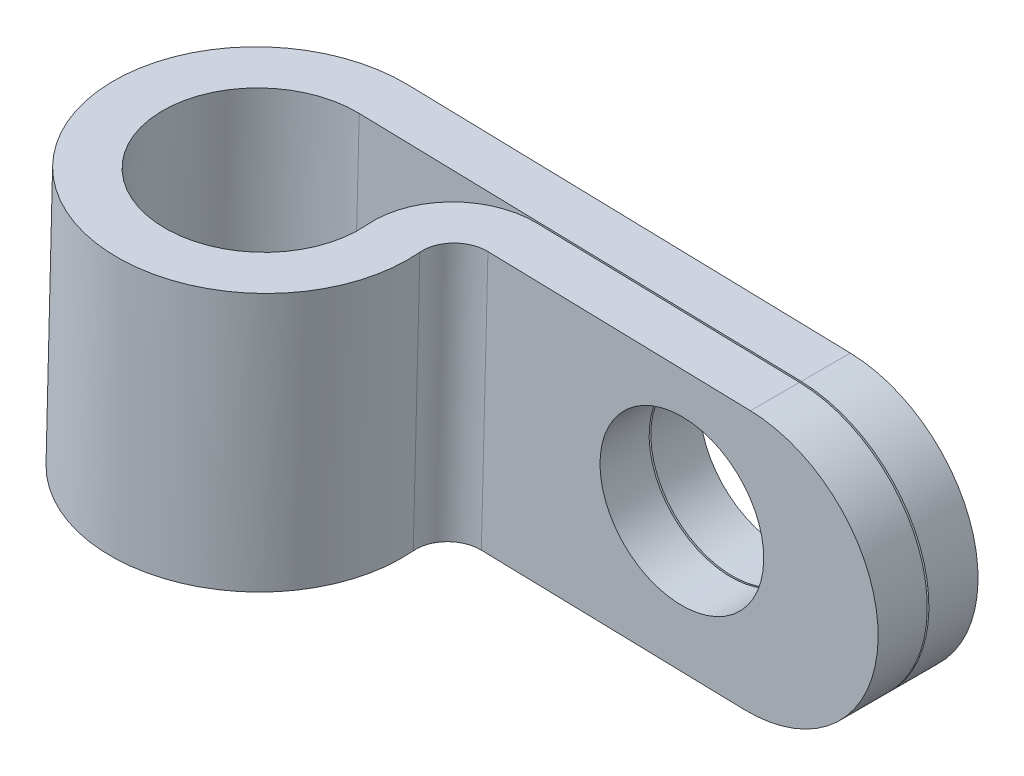
ISO-10303-21;
HEADER;
FILE_DESCRIPTION(('STEP AP214'),'2;1');
FILE_NAME('part.step','',(''),(''),'','','');
FILE_SCHEMA(('AUTOMOTIVE_DESIGN { 1 0 10303 214 1 1 1 1 }'));
ENDSEC;
DATA;
#1=APPLICATION_CONTEXT('core data for automotive mechanical design processes');
#2=APPLICATION_PROTOCOL_DEFINITION('international standard','automotive_design',2000,#1);
#3=PRODUCT_CONTEXT('',#1,'mechanical');
#4=PRODUCT('Part','Part','',(#3));
#5=PRODUCT_RELATED_PRODUCT_CATEGORY('part','',(#4));
#6=PRODUCT_DEFINITION_FORMATION('','',#4);
#7=PRODUCT_DEFINITION_CONTEXT('part definition',#1,'design');
#8=PRODUCT_DEFINITION('design','',#6,#7);
#9=PRODUCT_DEFINITION_SHAPE('','',#8);
#10=(LENGTH_UNIT() NAMED_UNIT(*) SI_UNIT(.MILLI.,.METRE.));
#11=(NAMED_UNIT(*) PLANE_ANGLE_UNIT() SI_UNIT($,.RADIAN.));
#12=(NAMED_UNIT(*) SI_UNIT($,.STERADIAN.) SOLID_ANGLE_UNIT());
#13=UNCERTAINTY_MEASURE_WITH_UNIT(LENGTH_MEASURE(1.E-05),#10,'distance_accuracy_value','');
#14=(GEOMETRIC_REPRESENTATION_CONTEXT(3) GLOBAL_UNCERTAINTY_ASSIGNED_CONTEXT((#13)) GLOBAL_UNIT_ASSIGNED_CONTEXT((#10,
#11,#12)) REPRESENTATION_CONTEXT('',''));
#15=CARTESIAN_POINT('',(0.,0.,0.));
#16=DIRECTION('',(0.,0.,1.));
#17=DIRECTION('',(1.,0.,0.));
#18=AXIS2_PLACEMENT_3D('',#15,#16,#17);
#19=CARTESIAN_POINT('',(-21.5504359375814,20.7594482708352,-3.73272260314341));
#20=DIRECTION('',(0.,0.,1.));
#21=DIRECTION('',(0.,-1.,0.));
#22=AXIS2_PLACEMENT_3D('',#19,#20,#21);
#23=PLANE('',#22);
#24=DIRECTION('',(0.025131250496468,0.999684160246867,0.));
#25=VECTOR('',#24,1.);
#26=CARTESIAN_POINT('',(-27.6538751413675,20.9128837913924,-3.73272260314341));
#27=LINE('',#26,#25);
#28=CARTESIAN_POINT('',(-27.5517417393499,24.9756002186357,-3.73272260314341));
#29=VERTEX_POINT('',#28);
#30=CARTESIAN_POINT('',(-27.6538751413675,20.9128837913924,-3.73272260314341));
#31=VERTEX_POINT('',#30);
#32=EDGE_CURVE('E107',#29,#31,#27,.F.);
#33=ORIENTED_EDGE('',*,*,#32,.T.);
#34=DIRECTION('',(0.999684160246867,-0.0251312504964654,0.));
#35=VECTOR('',#34,1.);
#36=CARTESIAN_POINT('',(-27.6538751413675,20.9128837913924,-3.73272260314341));
#37=LINE('',#36,#35);
#38=CARTESIAN_POINT('',(-23.581794151203,20.810514971844,-3.73272260314341));
#39=VERTEX_POINT('',#38);
#40=EDGE_CURVE('E105',#39,#31,#37,.F.);
#41=ORIENTED_EDGE('',*,*,#40,.F.);
#42=CARTESIAN_POINT('',(-23.5307274501941,22.8418731854656,-3.73272260314341));
#43=DIRECTION('',(0.,0.,-1.));
#44=DIRECTION('',(0.,1.,0.));
#45=AXIS2_PLACEMENT_3D('',#42,#43,#44);
#46=CIRCLE('',#45,2.032);
#47=CARTESIAN_POINT('',(-23.4796607491853,24.8732313990872,-3.73272260314341));
#48=VERTEX_POINT('',#47);
#49=EDGE_CURVE('E95',#48,#39,#46,.T.);
#50=ORIENTED_EDGE('',*,*,#49,.F.);
#51=DIRECTION('',(-0.999684160246867,0.0251312504964654,0.));
#52=VECTOR('',#51,1.);
#53=CARTESIAN_POINT('',(-28.0578786449514,24.9883240907004,-3.73272260314341));
#54=LINE('',#53,#52);
#55=EDGE_CURVE('E89',#29,#48,#54,.F.);
#56=ORIENTED_EDGE('',*,*,#55,.F.);
#57=EDGE_LOOP('',(#33,#41,#50,#56));
#58=FACE_BOUND('',#57,.T.);
#59=CARTESIAN_POINT('',(-24.543214888192,22.9943664243214,-3.73272260314341));
#60=DIRECTION('',(0.,0.,-1.));
#61=DIRECTION('',(0.,1.,0.));
#62=AXIS2_PLACEMENT_3D('',#59,#60,#61);
#63=CIRCLE('',#62,1.27);
#64=CARTESIAN_POINT('',(-24.543214888192,24.2643664243214,-3.73272260314341));
#65=VERTEX_POINT('',#64);
#66=EDGE_CURVE('E20',#65,#65,#63,.T.);
#67=ORIENTED_EDGE('',*,*,#66,.T.);
#68=EDGE_LOOP('',(#67));
#69=FACE_BOUND('',#68,.T.);
#70=ADVANCED_FACE('F17',(#58,#69),#23,.T.);
#71=CARTESIAN_POINT('',(-24.543214888192,22.9943664243214,-0.71012260314341));
#72=DIRECTION('',(0.,0.,-1.));
#73=DIRECTION('',(0.,1.,0.));
#74=AXIS2_PLACEMENT_3D('',#71,#72,#73);
#75=CYLINDRICAL_SURFACE('',#74,1.27);
#76=CARTESIAN_POINT('',(-24.543214888192,22.9943664243214,-4.49472260314341));
#77=DIRECTION('',(0.,0.,-1.));
#78=DIRECTION('',(0.,1.,0.));
#79=AXIS2_PLACEMENT_3D('',#76,#77,#78);
#80=CIRCLE('',#79,1.27);
#81=CARTESIAN_POINT('',(-24.543214888192,24.2643664243214,-4.49472260314341));
#82=VERTEX_POINT('',#81);
#83=EDGE_CURVE('E155',#82,#82,#80,.T.);
#84=ORIENTED_EDGE('',*,*,#83,.T.);
#85=EDGE_LOOP('',(#84));
#86=FACE_BOUND('',#85,.T.);
#87=ORIENTED_EDGE('',*,*,#66,.F.);
#88=EDGE_LOOP('',(#87));
#89=FACE_BOUND('',#88,.T.);
#90=ADVANCED_FACE('F208',(#86,#89),#75,.F.);
#91=CARTESIAN_POINT('',(-23.5307274501941,22.8418731854656,-3.18315896677978));
#92=DIRECTION('',(0.,0.,-1.));
#93=DIRECTION('',(0.,1.,0.));
#94=AXIS2_PLACEMENT_3D('',#91,#92,#93);
#95=CYLINDRICAL_SURFACE('',#94,2.032);
#96=CARTESIAN_POINT('',(-23.5307274501941,22.8418731854656,-4.49472260314341));
#97=DIRECTION('',(0.,0.,-1.));
#98=DIRECTION('',(0.,1.,0.));
#99=AXIS2_PLACEMENT_3D('',#96,#97,#98);
#100=CIRCLE('',#99,2.032);
#101=CARTESIAN_POINT('',(-23.581794151203,20.810514971844,-4.49472260314341));
#102=VERTEX_POINT('',#101);
#103=CARTESIAN_POINT('',(-23.4796607491853,24.8732313990872,-4.49472260314341));
#104=VERTEX_POINT('',#103);
#105=EDGE_CURVE('E153',#102,#104,#100,.F.);
#106=ORIENTED_EDGE('',*,*,#105,.T.);
#107=DIRECTION('',(0.,0.,1.));
#108=VECTOR('',#107,1.);
#109=CARTESIAN_POINT('',(-23.4796607491853,24.8732313990872,-3.18315896677978));
#110=LINE('',#109,#108);
#111=EDGE_CURVE('E102',#48,#104,#110,.F.);
#112=ORIENTED_EDGE('',*,*,#111,.F.);
#113=ORIENTED_EDGE('',*,*,#49,.T.);
#114=DIRECTION('',(0.,0.,-1.));
#115=VECTOR('',#114,1.);
#116=CARTESIAN_POINT('',(-23.581794151203,20.810514971844,-3.73272260314341));
#117=LINE('',#116,#115);
#118=EDGE_CURVE('E100',#39,#102,#117,.T.);
#119=ORIENTED_EDGE('',*,*,#118,.T.);
#120=EDGE_LOOP('',(#106,#112,#113,#119));
#121=FACE_BOUND('',#120,.T.);
#122=ADVANCED_FACE('F98',(#121),#95,.T.);
#123=CARTESIAN_POINT('',(-27.6538751413675,20.9128837913924,-3.22472260314341));
#124=DIRECTION('',(0.025131250496468,0.999684160246867,0.));
#125=DIRECTION('',(-0.999684160246867,0.025131250496468,0.));
#126=AXIS2_PLACEMENT_3D('',#123,#124,#125);
#127=CYLINDRICAL_SURFACE('',#126,0.508);
#128=DIRECTION('',(0.0251312504964649,0.999684160246867,0.));
#129=VECTOR('',#128,1.);
#130=CARTESIAN_POINT('',(-28.160012046969,20.9256076634571,-3.18315896677978));
#131=LINE('',#130,#129);
#132=CARTESIAN_POINT('',(-28.160012046969,20.9256076634572,-3.18315896677978));
#133=VERTEX_POINT('',#132);
#134=CARTESIAN_POINT('',(-28.0578786449514,24.9883240907004,-3.18315896677977));
#135=VERTEX_POINT('',#134);
#136=EDGE_CURVE('E149',#133,#135,#131,.T.);
#137=ORIENTED_EDGE('',*,*,#136,.F.);
#138=CARTESIAN_POINT('',(-27.6538751413675,20.9128837913924,-3.22472260314341));
#139=DIRECTION('',(0.025131250496468,0.999684160246867,0.));
#140=DIRECTION('',(-0.999684160246867,0.025131250496468,0.));
#141=AXIS2_PLACEMENT_3D('',#138,#139,#140);
#142=CIRCLE('',#141,0.508);
#143=EDGE_CURVE('E150',#31,#133,#142,.T.);
#144=ORIENTED_EDGE('',*,*,#143,.F.);
#145=ORIENTED_EDGE('',*,*,#32,.F.);
#146=CARTESIAN_POINT('',(-27.5517417393499,24.9756002186357,-3.22472260314341));
#147=DIRECTION('',(0.025131250496468,0.999684160246867,0.));
#148=DIRECTION('',(-0.999684160246867,0.025131250496468,0.));
#149=AXIS2_PLACEMENT_3D('',#146,#147,#148);
#150=CIRCLE('',#149,0.508);
#151=EDGE_CURVE('E158',#135,#29,#150,.F.);
#152=ORIENTED_EDGE('',*,*,#151,.F.);
#153=EDGE_LOOP('',(#137,#144,#145,#152));
#154=FACE_BOUND('',#153,.T.);
#155=ADVANCED_FACE('F204',(#154),#127,.F.);
#156=CARTESIAN_POINT('',(-21.5504359375814,20.7594482708352,-4.49472260314341));
#157=DIRECTION('',(0.,0.,1.));
#158=DIRECTION('',(0.,-1.,0.));
#159=AXIS2_PLACEMENT_3D('',#156,#157,#158);
#160=PLANE('',#159);
#161=ORIENTED_EDGE('',*,*,#105,.F.);
#162=DIRECTION('',(0.999684160246867,-0.0251312504964748,0.));
#163=VECTOR('',#162,1.);
#164=CARTESIAN_POINT('',(-27.6538751413675,20.9128837913924,-4.49472260314341));
#165=LINE('',#164,#163);
#166=CARTESIAN_POINT('',(-27.6538751413675,20.9128837913924,-4.49472260314341));
#167=VERTEX_POINT('',#166);
#168=EDGE_CURVE('E115',#167,#102,#165,.T.);
#169=ORIENTED_EDGE('',*,*,#168,.F.);
#170=DIRECTION('',(0.0251312504964653,0.999684160246867,0.));
#171=VECTOR('',#170,1.);
#172=CARTESIAN_POINT('',(-27.6538751413675,20.9128837913924,-4.49472260314341));
#173=LINE('',#172,#171);
#174=CARTESIAN_POINT('',(-27.5517417393499,24.9756002186356,-4.49472260314341));
#175=VERTEX_POINT('',#174);
#176=EDGE_CURVE('E146',#175,#167,#173,.F.);
#177=ORIENTED_EDGE('',*,*,#176,.F.);
#178=DIRECTION('',(-0.999684160246867,0.025131250496462,0.));
#179=VECTOR('',#178,1.);
#180=CARTESIAN_POINT('',(-23.4796607491853,24.8732313990872,-4.49472260314341));
#181=LINE('',#180,#179);
#182=EDGE_CURVE('E152',#104,#175,#181,.T.);
#183=ORIENTED_EDGE('',*,*,#182,.F.);
#184=EDGE_LOOP('',(#161,#169,#177,#183));
#185=FACE_BOUND('',#184,.T.);
#186=ORIENTED_EDGE('',*,*,#83,.F.);
#187=EDGE_LOOP('',(#186));
#188=FACE_BOUND('',#187,.T.);
#189=ADVANCED_FACE('F201',(#185,#188),#160,.F.);
#190=CARTESIAN_POINT('',(-27.6538751413675,20.9128837913924,-3.22472260314341));
#191=DIRECTION('',(0.0251312504964653,0.999684160246867,0.));
#192=DIRECTION('',(-0.999684160246867,0.0251312504964653,0.));
#193=AXIS2_PLACEMENT_3D('',#190,#191,#192);
#194=CYLINDRICAL_SURFACE('',#193,1.27);
#195=CARTESIAN_POINT('',(-27.6538751413675,20.9128837913924,-3.22472260314341));
#196=DIRECTION('',(0.0251312504964653,0.999684160246867,0.));
#197=DIRECTION('',(-0.999684160246867,0.0251312504964653,0.));
#198=AXIS2_PLACEMENT_3D('',#195,#196,#197);
#199=CIRCLE('',#198,1.27);
#200=CARTESIAN_POINT('',(-28.9192174053714,20.9446934715544,-3.12081351223432));
#201=VERTEX_POINT('',#200);
#202=EDGE_CURVE('E143',#167,#201,#199,.T.);
#203=ORIENTED_EDGE('',*,*,#202,.T.);
#204=DIRECTION('',(0.0251312504964656,0.999684160246867,0.));
#205=VECTOR('',#204,1.);
#206=CARTESIAN_POINT('',(-28.9192174053714,20.9446934715543,-3.12081351223432));
#207=LINE('',#206,#205);
#208=CARTESIAN_POINT('',(-28.8170840033537,25.0074098987976,-3.12081351223432));
#209=VERTEX_POINT('',#208);
#210=EDGE_CURVE('E142',#201,#209,#207,.T.);
#211=ORIENTED_EDGE('',*,*,#210,.T.);
#212=CARTESIAN_POINT('',(-27.5517417393499,24.9756002186356,-3.22472260314341));
#213=DIRECTION('',(0.0251312504964653,0.999684160246867,0.));
#214=DIRECTION('',(-0.999684160246867,0.0251312504964653,0.));
#215=AXIS2_PLACEMENT_3D('',#212,#213,#214);
#216=CIRCLE('',#215,1.27);
#217=EDGE_CURVE('E147',#209,#175,#216,.F.);
#218=ORIENTED_EDGE('',*,*,#217,.T.);
#219=ORIENTED_EDGE('',*,*,#176,.T.);
#220=EDGE_LOOP('',(#203,#211,#218,#219));
#221=FACE_BOUND('',#220,.T.);
#222=ADVANCED_FACE('F197',(#221),#194,.T.);
#223=CARTESIAN_POINT('',(-30.437628122176,20.9828650877487,-2.99612260314342));
#224=DIRECTION('',(0.0251312504964649,0.999684160246867,0.));
#225=DIRECTION('',(-0.999684160246867,0.0251312504964649,0.));
#226=AXIS2_PLACEMENT_3D('',#223,#224,#225);
#227=CYLINDRICAL_SURFACE('',#226,2.286);
#228=CARTESIAN_POINT('',(-30.3354947201584,25.045581514992,-2.99612260314341));
#229=DIRECTION('',(0.0251312504964649,0.999684160246867,0.));
#230=DIRECTION('',(-0.999684160246867,0.0251312504964649,0.));
#231=AXIS2_PLACEMENT_3D('',#228,#229,#230);
#232=CIRCLE('',#231,2.286);
#233=CARTESIAN_POINT('',(-30.3354947201584,25.045581514992,-5.28212260314341));
#234=VERTEX_POINT('',#233);
#235=EDGE_CURVE('E140',#234,#135,#232,.T.);
#236=ORIENTED_EDGE('',*,*,#235,.F.);
#237=DIRECTION('',(0.0251312504964697,0.999684160246867,0.));
#238=VECTOR('',#237,1.);
#239=CARTESIAN_POINT('',(-30.437628122176,20.9828650877487,-5.28212260314341));
#240=LINE('',#239,#238);
#241=CARTESIAN_POINT('',(-30.437628122176,20.9828650877487,-5.28212260314341));
#242=VERTEX_POINT('',#241);
#243=EDGE_CURVE('E137',#242,#234,#240,.T.);
#244=ORIENTED_EDGE('',*,*,#243,.F.);
#245=CARTESIAN_POINT('',(-30.437628122176,20.9828650877487,-2.99612260314342));
#246=DIRECTION('',(0.0251312504964649,0.999684160246867,0.));
#247=DIRECTION('',(-0.999684160246867,0.0251312504964649,0.));
#248=AXIS2_PLACEMENT_3D('',#245,#246,#247);
#249=CIRCLE('',#248,2.286);
#250=EDGE_CURVE('E138',#133,#242,#249,.F.);
#251=ORIENTED_EDGE('',*,*,#250,.F.);
#252=ORIENTED_EDGE('',*,*,#136,.T.);
#253=EDGE_LOOP('',(#236,#244,#251,#252));
#254=FACE_BOUND('',#253,.T.);
#255=ADVANCED_FACE('F238',(#254),#227,.T.);
#256=CARTESIAN_POINT('',(-21.5504359375814,20.7594482708352,-5.28212260314341));
#257=DIRECTION('',(0.,0.,-1.));
#258=DIRECTION('',(0.,1.,0.));
#259=AXIS2_PLACEMENT_3D('',#256,#257,#258);
#260=PLANE('',#259);
#261=DIRECTION('',(0.999684160246867,-0.0251312504964654,0.));
#262=VECTOR('',#261,1.);
#263=CARTESIAN_POINT('',(-27.6538751413675,20.9128837913924,-5.28212260314341));
#264=LINE('',#263,#262);
#265=CARTESIAN_POINT('',(-23.581794151203,20.810514971844,-5.28212260314341));
#266=VERTEX_POINT('',#265);
#267=EDGE_CURVE('E133',#242,#266,#264,.T.);
#268=ORIENTED_EDGE('',*,*,#267,.F.);
#269=ORIENTED_EDGE('',*,*,#243,.T.);
#270=DIRECTION('',(0.999684160246867,-0.0251312504964654,0.));
#271=VECTOR('',#270,1.);
#272=CARTESIAN_POINT('',(-27.5517417393499,24.9756002186357,-5.28212260314341));
#273=LINE('',#272,#271);
#274=CARTESIAN_POINT('',(-23.4796607491853,24.8732313990872,-5.28212260314341));
#275=VERTEX_POINT('',#274);
#276=EDGE_CURVE('E130',#234,#275,#273,.T.);
#277=ORIENTED_EDGE('',*,*,#276,.T.);
#278=CARTESIAN_POINT('',(-23.5307274501941,22.8418731854656,-5.28212260314341));
#279=DIRECTION('',(0.,0.,-1.));
#280=DIRECTION('',(0.,1.,0.));
#281=AXIS2_PLACEMENT_3D('',#278,#279,#280);
#282=CIRCLE('',#281,2.032);
#283=EDGE_CURVE('E125',#266,#275,#282,.F.);
#284=ORIENTED_EDGE('',*,*,#283,.F.);
#285=EDGE_LOOP('',(#268,#269,#277,#284));
#286=FACE_BOUND('',#285,.T.);
#287=CARTESIAN_POINT('',(-24.543214888192,22.9943664243214,-5.28212260314341));
#288=DIRECTION('',(0.,0.,-1.));
#289=DIRECTION('',(0.,1.,0.));
#290=AXIS2_PLACEMENT_3D('',#287,#288,#289);
#291=CIRCLE('',#290,1.27);
#292=CARTESIAN_POINT('',(-24.543214888192,24.2643664243214,-5.28212260314341));
#293=VERTEX_POINT('',#292);
#294=EDGE_CURVE('E134',#293,#293,#291,.F.);
#295=ORIENTED_EDGE('',*,*,#294,.T.);
#296=EDGE_LOOP('',(#295));
#297=FACE_BOUND('',#296,.T.);
#298=ADVANCED_FACE('F234',(#286,#297),#260,.T.);
#299=CARTESIAN_POINT('',(-24.543214888192,22.9943664243214,-0.71012260314341));
#300=DIRECTION('',(0.,0.,-1.));
#301=DIRECTION('',(0.,1.,0.));
#302=AXIS2_PLACEMENT_3D('',#299,#300,#301);
#303=CYLINDRICAL_SURFACE('',#302,1.27);
#304=CARTESIAN_POINT('',(-24.543214888192,22.9943664243214,-4.52012260314341));
#305=DIRECTION('',(0.,0.,-1.));
#306=DIRECTION('',(0.,1.,0.));
#307=AXIS2_PLACEMENT_3D('',#304,#305,#306);
#308=CIRCLE('',#307,1.27);
#309=CARTESIAN_POINT('',(-24.543214888192,24.2643664243214,-4.52012260314341));
#310=VERTEX_POINT('',#309);
#311=EDGE_CURVE('E121',#310,#310,#308,.F.);
#312=ORIENTED_EDGE('',*,*,#311,.T.);
#313=EDGE_LOOP('',(#312));
#314=FACE_BOUND('',#313,.T.);
#315=ORIENTED_EDGE('',*,*,#294,.F.);
#316=EDGE_LOOP('',(#315));
#317=FACE_BOUND('',#316,.T.);
#318=ADVANCED_FACE('F231',(#314,#317),#303,.F.);
#319=CARTESIAN_POINT('',(-27.6538751413675,20.9128837913924,-3.73272260314341));
#320=DIRECTION('',(-0.0251312504964654,-0.999684160246867,0.));
#321=DIRECTION('',(0.999684160246867,-0.0251312504964654,0.));
#322=AXIS2_PLACEMENT_3D('',#319,#320,#321);
#323=PLANE('',#322);
#324=DIRECTION('',(-0.999684160246867,0.0251312504964715,0.));
#325=VECTOR('',#324,1.);
#326=CARTESIAN_POINT('',(-23.581794151203,20.8105149718439,-4.52012260314341));
#327=LINE('',#326,#325);
#328=CARTESIAN_POINT('',(-23.581794151203,20.810514971844,-4.52012260314341));
#329=VERTEX_POINT('',#328);
#330=CARTESIAN_POINT('',(-30.437628122176,20.9828650877487,-4.52012260314341));
#331=VERTEX_POINT('',#330);
#332=EDGE_CURVE('E124',#329,#331,#327,.T.);
#333=ORIENTED_EDGE('',*,*,#332,.T.);
#334=CARTESIAN_POINT('',(-30.437628122176,20.9828650877487,-2.99612260314342));
#335=DIRECTION('',(0.0251312504964656,0.999684160246867,0.));
#336=DIRECTION('',(-0.999684160246867,0.0251312504964656,0.));
#337=AXIS2_PLACEMENT_3D('',#334,#335,#336);
#338=CIRCLE('',#337,1.524);
#339=EDGE_CURVE('E128',#331,#201,#338,.T.);
#340=ORIENTED_EDGE('',*,*,#339,.T.);
#341=ORIENTED_EDGE('',*,*,#202,.F.);
#342=ORIENTED_EDGE('',*,*,#168,.T.);
#343=ORIENTED_EDGE('',*,*,#118,.F.);
#344=ORIENTED_EDGE('',*,*,#40,.T.);
#345=ORIENTED_EDGE('',*,*,#143,.T.);
#346=ORIENTED_EDGE('',*,*,#250,.T.);
#347=ORIENTED_EDGE('',*,*,#267,.T.);
#348=DIRECTION('',(0.,0.,-1.));
#349=VECTOR('',#348,1.);
#350=CARTESIAN_POINT('',(-23.581794151203,20.810514971844,-4.52012260314341));
#351=LINE('',#350,#349);
#352=EDGE_CURVE('E127',#329,#266,#351,.T.);
#353=ORIENTED_EDGE('',*,*,#352,.F.);
#354=EDGE_LOOP('',(#333,#340,#341,#342,#343,#344,#345,#346,#347,#353));
#355=FACE_BOUND('',#354,.T.);
#356=ADVANCED_FACE('F113',(#355),#323,.T.);
#357=CARTESIAN_POINT('',(-30.437628122176,20.9828650877487,-2.99612260314342));
#358=DIRECTION('',(0.0251312504964656,0.999684160246867,0.));
#359=DIRECTION('',(-0.999684160246867,0.0251312504964656,0.));
#360=AXIS2_PLACEMENT_3D('',#357,#358,#359);
#361=CYLINDRICAL_SURFACE('',#360,1.524);
#362=ORIENTED_EDGE('',*,*,#339,.F.);
#363=DIRECTION('',(0.0251312504964697,0.999684160246867,0.));
#364=VECTOR('',#363,1.);
#365=CARTESIAN_POINT('',(-30.437628122176,20.9828650877487,-4.52012260314341));
#366=LINE('',#365,#364);
#367=CARTESIAN_POINT('',(-30.3354947201584,25.045581514992,-4.52012260314341));
#368=VERTEX_POINT('',#367);
#369=EDGE_CURVE('E175',#331,#368,#366,.T.);
#370=ORIENTED_EDGE('',*,*,#369,.T.);
#371=CARTESIAN_POINT('',(-30.3354947201584,25.045581514992,-2.99612260314341));
#372=DIRECTION('',(0.0251312504964656,0.999684160246867,0.));
#373=DIRECTION('',(-0.999684160246867,0.0251312504964656,0.));
#374=AXIS2_PLACEMENT_3D('',#371,#372,#373);
#375=CIRCLE('',#374,1.524);
#376=EDGE_CURVE('E131',#209,#368,#375,.F.);
#377=ORIENTED_EDGE('',*,*,#376,.F.);
#378=ORIENTED_EDGE('',*,*,#210,.F.);
#379=EDGE_LOOP('',(#362,#370,#377,#378));
#380=FACE_BOUND('',#379,.T.);
#381=ADVANCED_FACE('F193',(#380),#361,.F.);
#382=CARTESIAN_POINT('',(-27.5517417393499,24.9756002186356,-3.22472260314341));
#383=DIRECTION('',(-0.0251312504964654,-0.999684160246867,0.));
#384=DIRECTION('',(0.999684160246867,-0.0251312504964654,0.));
#385=AXIS2_PLACEMENT_3D('',#382,#383,#384);
#386=PLANE('',#385);
#387=DIRECTION('',(0.,0.,1.));
#388=VECTOR('',#387,1.);
#389=CARTESIAN_POINT('',(-23.4796607491853,24.8732313990872,-3.22472260314341));
#390=LINE('',#389,#388);
#391=CARTESIAN_POINT('',(-23.4796607491853,24.8732313990872,-4.52012260314341));
#392=VERTEX_POINT('',#391);
#393=EDGE_CURVE('E34',#275,#392,#390,.T.);
#394=ORIENTED_EDGE('',*,*,#393,.F.);
#395=ORIENTED_EDGE('',*,*,#276,.F.);
#396=ORIENTED_EDGE('',*,*,#235,.T.);
#397=ORIENTED_EDGE('',*,*,#151,.T.);
#398=ORIENTED_EDGE('',*,*,#55,.T.);
#399=ORIENTED_EDGE('',*,*,#111,.T.);
#400=ORIENTED_EDGE('',*,*,#182,.T.);
#401=ORIENTED_EDGE('',*,*,#217,.F.);
#402=ORIENTED_EDGE('',*,*,#376,.T.);
#403=DIRECTION('',(0.999684160246867,-0.0251312504964644,0.));
#404=VECTOR('',#403,1.);
#405=CARTESIAN_POINT('',(-30.3354947201584,25.045581514992,-4.52012260314341));
#406=LINE('',#405,#404);
#407=EDGE_CURVE('E26',#368,#392,#406,.T.);
#408=ORIENTED_EDGE('',*,*,#407,.T.);
#409=EDGE_LOOP('',(#394,#395,#396,#397,#398,#399,#400,#401,#402,#408));
#410=FACE_BOUND('',#409,.T.);
#411=ADVANCED_FACE('F184',(#410),#386,.F.);
#412=CARTESIAN_POINT('',(-23.5307274501941,22.8418731854656,-4.52012260314341));
#413=DIRECTION('',(0.,0.,-1.));
#414=DIRECTION('',(0.,1.,0.));
#415=AXIS2_PLACEMENT_3D('',#412,#413,#414);
#416=CYLINDRICAL_SURFACE('',#415,2.032);
#417=ORIENTED_EDGE('',*,*,#352,.T.);
#418=ORIENTED_EDGE('',*,*,#283,.T.);
#419=ORIENTED_EDGE('',*,*,#393,.T.);
#420=CARTESIAN_POINT('',(-23.5307274501941,22.8418731854656,-4.52012260314341));
#421=DIRECTION('',(0.,0.,1.));
#422=DIRECTION('',(0.,-1.,0.));
#423=AXIS2_PLACEMENT_3D('',#420,#421,#422);
#424=CIRCLE('',#423,2.032);
#425=EDGE_CURVE('E11',#392,#329,#424,.F.);
#426=ORIENTED_EDGE('',*,*,#425,.T.);
#427=EDGE_LOOP('',(#417,#418,#419,#426));
#428=FACE_BOUND('',#427,.T.);
#429=ADVANCED_FACE('F218',(#428),#416,.T.);
#430=CARTESIAN_POINT('',(-21.5504359375814,20.7594482708352,-4.52012260314341));
#431=DIRECTION('',(0.,0.,-1.));
#432=DIRECTION('',(0.,1.,0.));
#433=AXIS2_PLACEMENT_3D('',#430,#431,#432);
#434=PLANE('',#433);
#435=ORIENTED_EDGE('',*,*,#425,.F.);
#436=ORIENTED_EDGE('',*,*,#407,.F.);
#437=ORIENTED_EDGE('',*,*,#369,.F.);
#438=ORIENTED_EDGE('',*,*,#332,.F.);
#439=EDGE_LOOP('',(#435,#436,#437,#438));
#440=FACE_BOUND('',#439,.T.);
#441=ORIENTED_EDGE('',*,*,#311,.F.);
#442=EDGE_LOOP('',(#441));
#443=FACE_BOUND('',#442,.T.);
#444=ADVANCED_FACE('F189',(#440,#443),#434,.F.);
#445=CLOSED_SHELL('',(#70,#90,#122,#155,#189,#222,#255,#298,#318,#356,#381,#411,#429,#444));
#446=MANIFOLD_SOLID_BREP('B1',#445);
#447=ADVANCED_BREP_SHAPE_REPRESENTATION('',(#18,#446),#14);
#448=SHAPE_DEFINITION_REPRESENTATION(#9,#447);
ENDSEC;
END-ISO-10303-21;
